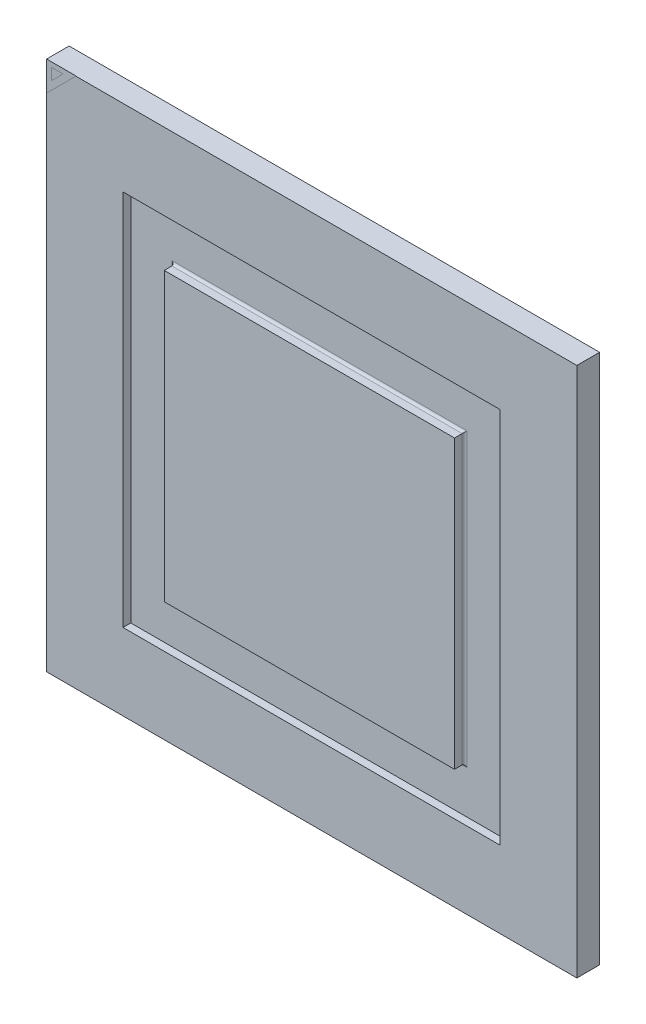
ISO-10303-21;
HEADER;
FILE_DESCRIPTION(('STEP AP214'),'2;1');
FILE_NAME('part.step','',(''),(''),'','','');
FILE_SCHEMA(('AUTOMOTIVE_DESIGN { 1 0 10303 214 1 1 1 1 }'));
ENDSEC;
DATA;
#1=APPLICATION_CONTEXT('core data for automotive mechanical design processes');
#2=APPLICATION_PROTOCOL_DEFINITION('international standard','automotive_design',2000,#1);
#3=PRODUCT_CONTEXT('',#1,'mechanical');
#4=PRODUCT('Part','Part','',(#3));
#5=PRODUCT_RELATED_PRODUCT_CATEGORY('part','',(#4));
#6=PRODUCT_DEFINITION_FORMATION('','',#4);
#7=PRODUCT_DEFINITION_CONTEXT('part definition',#1,'design');
#8=PRODUCT_DEFINITION('design','',#6,#7);
#9=PRODUCT_DEFINITION_SHAPE('','',#8);
#10=(LENGTH_UNIT() NAMED_UNIT(*) SI_UNIT(.MILLI.,.METRE.));
#11=(NAMED_UNIT(*) PLANE_ANGLE_UNIT() SI_UNIT($,.RADIAN.));
#12=(NAMED_UNIT(*) SI_UNIT($,.STERADIAN.) SOLID_ANGLE_UNIT());
#13=UNCERTAINTY_MEASURE_WITH_UNIT(LENGTH_MEASURE(1.E-05),#10,'distance_accuracy_value','');
#14=(GEOMETRIC_REPRESENTATION_CONTEXT(3) GLOBAL_UNCERTAINTY_ASSIGNED_CONTEXT((#13)) GLOBAL_UNIT_ASSIGNED_CONTEXT((#10,
#11,#12)) REPRESENTATION_CONTEXT('',''));
#15=CARTESIAN_POINT('',(0.,0.,0.));
#16=DIRECTION('',(0.,0.,1.));
#17=DIRECTION('',(1.,0.,0.));
#18=AXIS2_PLACEMENT_3D('',#15,#16,#17);
#19=CARTESIAN_POINT('',(-22.4999999999989,-22.4999999999989,2.41999999999997));
#20=DIRECTION('',(0.,0.,1.));
#21=DIRECTION('',(1.,0.,0.));
#22=AXIS2_PLACEMENT_3D('',#19,#20,#21);
#23=PLANE('',#22);
#24=DIRECTION('',(0.,1.,0.));
#25=VECTOR('',#24,1.);
#26=CARTESIAN_POINT('',(-12.309999999999,-12.1699999999996,2.41999999999997));
#27=LINE('',#26,#25);
#28=CARTESIAN_POINT('',(-12.309999999999,12.1699999999996,2.41999999999997));
#29=VERTEX_POINT('',#28);
#30=CARTESIAN_POINT('',(-12.309999999999,-12.1699999999996,2.41999999999997));
#31=VERTEX_POINT('',#30);
#32=EDGE_CURVE('E156',#29,#31,#27,.F.);
#33=ORIENTED_EDGE('',*,*,#32,.T.);
#34=DIRECTION('',(1.,0.,0.));
#35=VECTOR('',#34,1.);
#36=CARTESIAN_POINT('',(12.309999999999,-12.1699999999996,2.41999999999997));
#37=LINE('',#36,#35);
#38=CARTESIAN_POINT('',(12.309999999999,-12.1699999999996,2.41999999999997));
#39=VERTEX_POINT('',#38);
#40=EDGE_CURVE('E152',#31,#39,#37,.T.);
#41=ORIENTED_EDGE('',*,*,#40,.T.);
#42=DIRECTION('',(0.,1.,0.));
#43=VECTOR('',#42,1.);
#44=CARTESIAN_POINT('',(12.309999999999,12.1699999999996,2.41999999999997));
#45=LINE('',#44,#43);
#46=CARTESIAN_POINT('',(12.309999999999,12.1699999999996,2.41999999999997));
#47=VERTEX_POINT('',#46);
#48=EDGE_CURVE('E194',#39,#47,#45,.T.);
#49=ORIENTED_EDGE('',*,*,#48,.T.);
#50=DIRECTION('',(1.,0.,0.));
#51=VECTOR('',#50,1.);
#52=CARTESIAN_POINT('',(-12.309999999999,12.1699999999996,2.41999999999997));
#53=LINE('',#52,#51);
#54=EDGE_CURVE('E155',#47,#29,#53,.F.);
#55=ORIENTED_EDGE('',*,*,#54,.T.);
#56=EDGE_LOOP('',(#33,#41,#49,#55));
#57=FACE_BOUND('',#56,.T.);
#58=ADVANCED_FACE('F16',(#57),#23,.T.);
#59=CARTESIAN_POINT('',(12.309999999999,-12.1699999999996,2.41999999999997));
#60=DIRECTION('',(0.,1.,0.));
#61=DIRECTION('',(0.,0.,1.));
#62=AXIS2_PLACEMENT_3D('',#59,#60,#61);
#63=PLANE('',#62);
#64=ORIENTED_EDGE('',*,*,#40,.F.);
#65=DIRECTION('',(0.,0.,-1.));
#66=VECTOR('',#65,1.);
#67=CARTESIAN_POINT('',(-12.309999999999,-12.1699999999996,2.41999999999997));
#68=LINE('',#67,#66);
#69=CARTESIAN_POINT('',(-12.3099999999999,-12.169999999999,1.77000000000003));
#70=VERTEX_POINT('',#69);
#71=EDGE_CURVE('E145',#31,#70,#68,.T.);
#72=ORIENTED_EDGE('',*,*,#71,.T.);
#73=DIRECTION('',(1.,0.,0.));
#74=VECTOR('',#73,1.);
#75=CARTESIAN_POINT('',(-81.1620000000086,-12.1699999999988,1.77000000000003));
#76=LINE('',#75,#74);
#77=CARTESIAN_POINT('',(12.3099999999999,-12.169999999999,1.77000000000003));
#78=VERTEX_POINT('',#77);
#79=EDGE_CURVE('E150',#70,#78,#76,.T.);
#80=ORIENTED_EDGE('',*,*,#79,.T.);
#81=DIRECTION('',(0.,0.,1.));
#82=VECTOR('',#81,1.);
#83=CARTESIAN_POINT('',(12.309999999999,-12.1699999999996,2.41999999999997));
#84=LINE('',#83,#82);
#85=EDGE_CURVE('E192',#78,#39,#84,.T.);
#86=ORIENTED_EDGE('',*,*,#85,.T.);
#87=EDGE_LOOP('',(#64,#72,#80,#86));
#88=FACE_BOUND('',#87,.T.);
#89=ADVANCED_FACE('F147',(#88),#63,.F.);
#90=CARTESIAN_POINT('',(-12.309999999999,-12.1699999999996,2.41999999999997));
#91=DIRECTION('',(1.,0.,0.));
#92=DIRECTION('',(0.,0.,-1.));
#93=AXIS2_PLACEMENT_3D('',#90,#91,#92);
#94=PLANE('',#93);
#95=ORIENTED_EDGE('',*,*,#32,.F.);
#96=DIRECTION('',(0.,0.,-1.));
#97=VECTOR('',#96,1.);
#98=CARTESIAN_POINT('',(-12.309999999999,12.1699999999996,2.41999999999997));
#99=LINE('',#98,#97);
#100=CARTESIAN_POINT('',(-12.3099999999999,12.169999999999,1.77000000000003));
#101=VERTEX_POINT('',#100);
#102=EDGE_CURVE('E162',#29,#101,#99,.T.);
#103=ORIENTED_EDGE('',*,*,#102,.T.);
#104=DIRECTION('',(0.,-1.,0.));
#105=VECTOR('',#104,1.);
#106=CARTESIAN_POINT('',(-12.3100000000008,81.1620000000086,1.77000000000003));
#107=LINE('',#106,#105);
#108=EDGE_CURVE('E159',#101,#70,#107,.T.);
#109=ORIENTED_EDGE('',*,*,#108,.T.);
#110=ORIENTED_EDGE('',*,*,#71,.F.);
#111=EDGE_LOOP('',(#95,#103,#109,#110));
#112=FACE_BOUND('',#111,.T.);
#113=ADVANCED_FACE('F160',(#112),#94,.F.);
#114=CARTESIAN_POINT('',(-12.309999999999,12.1699999999996,2.41999999999997));
#115=DIRECTION('',(0.,-1.,0.));
#116=DIRECTION('',(0.,0.,-1.));
#117=AXIS2_PLACEMENT_3D('',#114,#115,#116);
#118=PLANE('',#117);
#119=ORIENTED_EDGE('',*,*,#54,.F.);
#120=DIRECTION('',(0.,0.,1.));
#121=VECTOR('',#120,1.);
#122=CARTESIAN_POINT('',(12.309999999999,12.1699999999996,2.41999999999997));
#123=LINE('',#122,#121);
#124=CARTESIAN_POINT('',(12.3099999999999,12.169999999999,1.77000000000003));
#125=VERTEX_POINT('',#124);
#126=EDGE_CURVE('E175',#47,#125,#123,.F.);
#127=ORIENTED_EDGE('',*,*,#126,.T.);
#128=DIRECTION('',(-1.,0.,0.));
#129=VECTOR('',#128,1.);
#130=CARTESIAN_POINT('',(81.1620000000086,12.1699999999988,1.77000000000003));
#131=LINE('',#130,#129);
#132=EDGE_CURVE('E181',#125,#101,#131,.T.);
#133=ORIENTED_EDGE('',*,*,#132,.T.);
#134=ORIENTED_EDGE('',*,*,#102,.F.);
#135=EDGE_LOOP('',(#119,#127,#133,#134));
#136=FACE_BOUND('',#135,.T.);
#137=ADVANCED_FACE('F422',(#136),#118,.F.);
#138=CARTESIAN_POINT('',(12.309999999999,12.1699999999996,2.41999999999997));
#139=DIRECTION('',(-1.,0.,0.));
#140=DIRECTION('',(0.,0.,1.));
#141=AXIS2_PLACEMENT_3D('',#138,#139,#140);
#142=PLANE('',#141);
#143=ORIENTED_EDGE('',*,*,#48,.F.);
#144=ORIENTED_EDGE('',*,*,#85,.F.);
#145=DIRECTION('',(0.,1.,0.));
#146=VECTOR('',#145,1.);
#147=CARTESIAN_POINT('',(12.3100000000008,-81.1620000000086,1.77000000000003));
#148=LINE('',#147,#146);
#149=EDGE_CURVE('E203',#78,#125,#148,.T.);
#150=ORIENTED_EDGE('',*,*,#149,.T.);
#151=ORIENTED_EDGE('',*,*,#126,.F.);
#152=EDGE_LOOP('',(#143,#144,#150,#151));
#153=FACE_BOUND('',#152,.T.);
#154=ADVANCED_FACE('F419',(#153),#142,.F.);
#155=CARTESIAN_POINT('',(-81.1620000000086,-12.3699999999988,1.77000000000003));
#156=DIRECTION('',(1.,0.,0.));
#157=DIRECTION('',(0.,0.,-1.));
#158=AXIS2_PLACEMENT_3D('',#155,#156,#157);
#159=CYLINDRICAL_SURFACE('',#158,0.199999999999987);
#160=ORIENTED_EDGE('',*,*,#79,.F.);
#161=CARTESIAN_POINT('',(-12.5100000000008,-12.3699999999988,1.77000000000003));
#162=DIRECTION('',(0.707106781186547,-0.707106781186547,0.));
#163=DIRECTION('',(0.707106781186547,0.707106781186547,0.));
#164=AXIS2_PLACEMENT_3D('',#161,#162,#163);
#165=ELLIPSE('',#164,0.282842712474601,0.199999999999987);
#166=CARTESIAN_POINT('',(-12.5100000000008,-12.3699999999988,1.57000000000007));
#167=VERTEX_POINT('',#166);
#168=EDGE_CURVE('E19',#70,#167,#165,.F.);
#169=ORIENTED_EDGE('',*,*,#168,.T.);
#170=DIRECTION('',(1.,0.,0.));
#171=VECTOR('',#170,1.);
#172=CARTESIAN_POINT('',(0.,-12.3699999999988,1.57000000000007));
#173=LINE('',#172,#171);
#174=CARTESIAN_POINT('',(12.5100000000008,-12.3699999999988,1.57000000000007));
#175=VERTEX_POINT('',#174);
#176=EDGE_CURVE('E188',#175,#167,#173,.F.);
#177=ORIENTED_EDGE('',*,*,#176,.F.);
#178=CARTESIAN_POINT('',(12.5100000000008,-12.3699999999988,1.77000000000003));
#179=DIRECTION('',(0.707106781186547,0.707106781186547,0.));
#180=DIRECTION('',(0.707106781186547,-0.707106781186547,0.));
#181=AXIS2_PLACEMENT_3D('',#178,#179,#180);
#182=ELLIPSE('',#181,0.282842712474601,0.199999999999987);
#183=EDGE_CURVE('E173',#175,#78,#182,.T.);
#184=ORIENTED_EDGE('',*,*,#183,.T.);
#185=EDGE_LOOP('',(#160,#169,#177,#184));
#186=FACE_BOUND('',#185,.T.);
#187=ADVANCED_FACE('F170',(#186),#159,.F.);
#188=CARTESIAN_POINT('',(-12.5100000000008,81.1620000000086,1.77000000000003));
#189=DIRECTION('',(0.,-1.,0.));
#190=DIRECTION('',(0.,0.,-1.));
#191=AXIS2_PLACEMENT_3D('',#188,#189,#190);
#192=CYLINDRICAL_SURFACE('',#191,0.199999999999987);
#193=DIRECTION('',(0.,1.,0.));
#194=VECTOR('',#193,1.);
#195=CARTESIAN_POINT('',(-12.5100000000008,-22.4999999999989,1.57000000000007));
#196=LINE('',#195,#194);
#197=CARTESIAN_POINT('',(-12.5100000000008,12.3699999999988,1.57000000000007));
#198=VERTEX_POINT('',#197);
#199=EDGE_CURVE('E179',#167,#198,#196,.T.);
#200=ORIENTED_EDGE('',*,*,#199,.F.);
#201=ORIENTED_EDGE('',*,*,#168,.F.);
#202=ORIENTED_EDGE('',*,*,#108,.F.);
#203=CARTESIAN_POINT('',(-12.5100000000008,12.3699999999988,1.77000000000003));
#204=DIRECTION('',(-0.707106781186547,-0.707106781186547,0.));
#205=DIRECTION('',(0.707106781186547,-0.707106781186547,0.));
#206=AXIS2_PLACEMENT_3D('',#203,#204,#205);
#207=ELLIPSE('',#206,0.282842712474601,0.199999999999987);
#208=EDGE_CURVE('E182',#101,#198,#207,.F.);
#209=ORIENTED_EDGE('',*,*,#208,.T.);
#210=EDGE_LOOP('',(#200,#201,#202,#209));
#211=FACE_BOUND('',#210,.T.);
#212=ADVANCED_FACE('F177',(#211),#192,.F.);
#213=CARTESIAN_POINT('',(81.1620000000086,12.3699999999988,1.77000000000003));
#214=DIRECTION('',(-1.,0.,0.));
#215=DIRECTION('',(0.,0.,1.));
#216=AXIS2_PLACEMENT_3D('',#213,#214,#215);
#217=CYLINDRICAL_SURFACE('',#216,0.199999999999987);
#218=DIRECTION('',(1.,0.,0.));
#219=VECTOR('',#218,1.);
#220=CARTESIAN_POINT('',(0.,12.3699999999988,1.57000000000007));
#221=LINE('',#220,#219);
#222=CARTESIAN_POINT('',(12.5100000000008,12.3699999999988,1.57000000000007));
#223=VERTEX_POINT('',#222);
#224=EDGE_CURVE('E190',#198,#223,#221,.T.);
#225=ORIENTED_EDGE('',*,*,#224,.F.);
#226=ORIENTED_EDGE('',*,*,#208,.F.);
#227=ORIENTED_EDGE('',*,*,#132,.F.);
#228=CARTESIAN_POINT('',(12.5100000000008,12.3699999999988,1.77000000000003));
#229=DIRECTION('',(-0.707106781186547,0.707106781186547,0.));
#230=DIRECTION('',(-0.707106781186547,-0.707106781186547,0.));
#231=AXIS2_PLACEMENT_3D('',#228,#229,#230);
#232=ELLIPSE('',#231,0.282842712474601,0.199999999999987);
#233=EDGE_CURVE('E201',#125,#223,#232,.F.);
#234=ORIENTED_EDGE('',*,*,#233,.T.);
#235=EDGE_LOOP('',(#225,#226,#227,#234));
#236=FACE_BOUND('',#235,.T.);
#237=ADVANCED_FACE('F410',(#236),#217,.F.);
#238=CARTESIAN_POINT('',(12.5100000000008,-81.1620000000086,1.77000000000003));
#239=DIRECTION('',(0.,1.,0.));
#240=DIRECTION('',(0.,0.,1.));
#241=AXIS2_PLACEMENT_3D('',#238,#239,#240);
#242=CYLINDRICAL_SURFACE('',#241,0.199999999999987);
#243=ORIENTED_EDGE('',*,*,#149,.F.);
#244=ORIENTED_EDGE('',*,*,#183,.F.);
#245=DIRECTION('',(0.,1.,0.));
#246=VECTOR('',#245,1.);
#247=CARTESIAN_POINT('',(12.5100000000008,-22.4999999999989,1.57000000000007));
#248=LINE('',#247,#246);
#249=EDGE_CURVE('E214',#223,#175,#248,.F.);
#250=ORIENTED_EDGE('',*,*,#249,.F.);
#251=ORIENTED_EDGE('',*,*,#233,.F.);
#252=EDGE_LOOP('',(#243,#244,#250,#251));
#253=FACE_BOUND('',#252,.T.);
#254=ADVANCED_FACE('F404',(#253),#242,.F.);
#255=CARTESIAN_POINT('',(0.,-22.4999999999989,2.18999999999988));
#256=DIRECTION('',(0.,0.,1.));
#257=DIRECTION('',(1.,0.,0.));
#258=AXIS2_PLACEMENT_3D('',#255,#256,#257);
#259=PLANE('',#258);
#260=DIRECTION('',(1.,0.,0.));
#261=VECTOR('',#260,1.);
#262=CARTESIAN_POINT('',(-21.0999999999994,22.1000000000005,2.18999999999988));
#263=LINE('',#262,#261);
#264=CARTESIAN_POINT('',(-21.0999999999994,22.1000000000005,2.18999999999988));
#265=VERTEX_POINT('',#264);
#266=CARTESIAN_POINT('',(-22.1000000000005,22.1000000000005,2.18999999999988));
#267=VERTEX_POINT('',#266);
#268=EDGE_CURVE('E211',#265,#267,#263,.F.);
#269=ORIENTED_EDGE('',*,*,#268,.T.);
#270=DIRECTION('',(0.,1.,0.));
#271=VECTOR('',#270,1.);
#272=CARTESIAN_POINT('',(-22.1000000000005,22.1000000000005,2.18999999999988));
#273=LINE('',#272,#271);
#274=CARTESIAN_POINT('',(-22.1000000000005,21.0999999999994,2.18999999999988));
#275=VERTEX_POINT('',#274);
#276=EDGE_CURVE('E228',#267,#275,#273,.F.);
#277=ORIENTED_EDGE('',*,*,#276,.T.);
#278=DIRECTION('',(0.707106781186548,0.707106781186548,0.));
#279=VECTOR('',#278,1.);
#280=CARTESIAN_POINT('',(-22.1000000000005,21.0999999999994,2.18999999999988));
#281=LINE('',#280,#279);
#282=EDGE_CURVE('E218',#275,#265,#281,.T.);
#283=ORIENTED_EDGE('',*,*,#282,.T.);
#284=EDGE_LOOP('',(#269,#277,#283));
#285=FACE_BOUND('',#284,.T.);
#286=ADVANCED_FACE('F396',(#285),#259,.T.);
#287=CARTESIAN_POINT('',(0.,-22.4999999999989,1.57000000000007));
#288=DIRECTION('',(0.,0.,1.));
#289=DIRECTION('',(1.,0.,0.));
#290=AXIS2_PLACEMENT_3D('',#287,#288,#289);
#291=PLANE('',#290);
#292=ORIENTED_EDGE('',*,*,#224,.T.);
#293=ORIENTED_EDGE('',*,*,#249,.T.);
#294=ORIENTED_EDGE('',*,*,#176,.T.);
#295=ORIENTED_EDGE('',*,*,#199,.T.);
#296=EDGE_LOOP('',(#292,#293,#294,#295));
#297=FACE_BOUND('',#296,.T.);
#298=DIRECTION('',(0.,1.,0.));
#299=VECTOR('',#298,1.);
#300=CARTESIAN_POINT('',(-15.9999999999995,-15.9999999999995,1.57000000000007));
#301=LINE('',#300,#299);
#302=CARTESIAN_POINT('',(-15.9999999999995,-15.9999999999995,1.57000000000007));
#303=VERTEX_POINT('',#302);
#304=CARTESIAN_POINT('',(-15.9999999999995,15.9999999999995,1.57000000000007));
#305=VERTEX_POINT('',#304);
#306=EDGE_CURVE('E236',#303,#305,#301,.T.);
#307=ORIENTED_EDGE('',*,*,#306,.F.);
#308=DIRECTION('',(1.,0.,0.));
#309=VECTOR('',#308,1.);
#310=CARTESIAN_POINT('',(15.9999999999995,-15.9999999999995,1.57000000000007));
#311=LINE('',#310,#309);
#312=CARTESIAN_POINT('',(15.9999999999995,-15.9999999999995,1.57000000000007));
#313=VERTEX_POINT('',#312);
#314=EDGE_CURVE('E254',#313,#303,#311,.F.);
#315=ORIENTED_EDGE('',*,*,#314,.F.);
#316=DIRECTION('',(0.,1.,0.));
#317=VECTOR('',#316,1.);
#318=CARTESIAN_POINT('',(15.9999999999995,15.9999999999995,1.57000000000007));
#319=LINE('',#318,#317);
#320=CARTESIAN_POINT('',(15.9999999999995,15.9999999999995,1.57000000000007));
#321=VERTEX_POINT('',#320);
#322=EDGE_CURVE('E246',#321,#313,#319,.F.);
#323=ORIENTED_EDGE('',*,*,#322,.F.);
#324=DIRECTION('',(1.,0.,0.));
#325=VECTOR('',#324,1.);
#326=CARTESIAN_POINT('',(-15.9999999999995,15.9999999999995,1.57000000000007));
#327=LINE('',#326,#325);
#328=EDGE_CURVE('E241',#305,#321,#327,.T.);
#329=ORIENTED_EDGE('',*,*,#328,.F.);
#330=EDGE_LOOP('',(#307,#315,#323,#329));
#331=FACE_BOUND('',#330,.T.);
#332=ADVANCED_FACE('F391',(#297,#331),#291,.T.);
#333=CARTESIAN_POINT('',(-21.0999999999994,22.1000000000005,2.21000000000005));
#334=DIRECTION('',(0.,1.,0.));
#335=DIRECTION('',(0.,0.,1.));
#336=AXIS2_PLACEMENT_3D('',#333,#334,#335);
#337=PLANE('',#336);
#338=ORIENTED_EDGE('',*,*,#268,.F.);
#339=DIRECTION('',(0.,0.,1.));
#340=VECTOR('',#339,1.);
#341=CARTESIAN_POINT('',(-21.0999999999994,22.1000000000005,2.21000000000005));
#342=LINE('',#341,#340);
#343=CARTESIAN_POINT('',(-21.0999999999994,22.1000000000005,2.21000000000005));
#344=VERTEX_POINT('',#343);
#345=EDGE_CURVE('E222',#265,#344,#342,.T.);
#346=ORIENTED_EDGE('',*,*,#345,.T.);
#347=DIRECTION('',(1.,0.,0.));
#348=VECTOR('',#347,1.);
#349=CARTESIAN_POINT('',(0.,22.1000000000005,2.21000000000005));
#350=LINE('',#349,#348);
#351=CARTESIAN_POINT('',(-22.1000000000005,22.1000000000005,2.21000000000005));
#352=VERTEX_POINT('',#351);
#353=EDGE_CURVE('E260',#352,#344,#350,.T.);
#354=ORIENTED_EDGE('',*,*,#353,.F.);
#355=DIRECTION('',(0.,0.,1.));
#356=VECTOR('',#355,1.);
#357=CARTESIAN_POINT('',(-22.1000000000005,22.1000000000005,2.21000000000005));
#358=LINE('',#357,#356);
#359=EDGE_CURVE('E224',#352,#267,#358,.F.);
#360=ORIENTED_EDGE('',*,*,#359,.T.);
#361=EDGE_LOOP('',(#338,#346,#354,#360));
#362=FACE_BOUND('',#361,.T.);
#363=ADVANCED_FACE('F395',(#362),#337,.F.);
#364=CARTESIAN_POINT('',(-22.1000000000005,21.0999999999994,2.21000000000005));
#365=DIRECTION('',(0.707106781186548,-0.707106781186548,0.));
#366=DIRECTION('',(0.707106781186548,0.707106781186548,0.));
#367=AXIS2_PLACEMENT_3D('',#364,#365,#366);
#368=PLANE('',#367);
#369=ORIENTED_EDGE('',*,*,#282,.F.);
#370=DIRECTION('',(0.,0.,1.));
#371=VECTOR('',#370,1.);
#372=CARTESIAN_POINT('',(-22.1000000000005,21.0999999999994,2.21000000000005));
#373=LINE('',#372,#371);
#374=CARTESIAN_POINT('',(-22.1000000000005,21.0999999999994,2.21000000000005));
#375=VERTEX_POINT('',#374);
#376=EDGE_CURVE('E230',#275,#375,#373,.T.);
#377=ORIENTED_EDGE('',*,*,#376,.T.);
#378=DIRECTION('',(-0.707106781186547,-0.707106781186547,0.));
#379=VECTOR('',#378,1.);
#380=CARTESIAN_POINT('',(-21.0999999999994,22.1000000000005,2.21000000000005));
#381=LINE('',#380,#379);
#382=EDGE_CURVE('E263',#344,#375,#381,.T.);
#383=ORIENTED_EDGE('',*,*,#382,.F.);
#384=ORIENTED_EDGE('',*,*,#345,.F.);
#385=EDGE_LOOP('',(#369,#377,#383,#384));
#386=FACE_BOUND('',#385,.T.);
#387=ADVANCED_FACE('F351',(#386),#368,.F.);
#388=CARTESIAN_POINT('',(-22.1000000000005,22.1000000000005,2.21000000000005));
#389=DIRECTION('',(-1.,0.,0.));
#390=DIRECTION('',(0.,0.,1.));
#391=AXIS2_PLACEMENT_3D('',#388,#389,#390);
#392=PLANE('',#391);
#393=ORIENTED_EDGE('',*,*,#276,.F.);
#394=ORIENTED_EDGE('',*,*,#359,.F.);
#395=DIRECTION('',(0.,1.,0.));
#396=VECTOR('',#395,1.);
#397=CARTESIAN_POINT('',(-22.1000000000005,-22.4999999999989,2.21000000000005));
#398=LINE('',#397,#396);
#399=EDGE_CURVE('E266',#375,#352,#398,.T.);
#400=ORIENTED_EDGE('',*,*,#399,.F.);
#401=ORIENTED_EDGE('',*,*,#376,.F.);
#402=EDGE_LOOP('',(#393,#394,#400,#401));
#403=FACE_BOUND('',#402,.T.);
#404=ADVANCED_FACE('F341',(#403),#392,.F.);
#405=CARTESIAN_POINT('',(-22.4999999999989,19.9999999999987,2.22999999999997));
#406=DIRECTION('',(0.707106781186548,-0.707106781186548,0.));
#407=DIRECTION('',(0.707106781186548,0.707106781186548,0.));
#408=AXIS2_PLACEMENT_3D('',#405,#406,#407);
#409=PLANE('',#408);
#410=DIRECTION('',(0.707106781186547,0.707106781186548,0.));
#411=VECTOR('',#410,1.);
#412=CARTESIAN_POINT('',(-22.4999999999989,19.9999999999987,2.21000000000005));
#413=LINE('',#412,#411);
#414=CARTESIAN_POINT('',(-22.4999999999989,19.9999999999987,2.21000000000005));
#415=VERTEX_POINT('',#414);
#416=CARTESIAN_POINT('',(-19.9999999999987,22.4999999999989,2.21000000000005));
#417=VERTEX_POINT('',#416);
#418=EDGE_CURVE('E257',#415,#417,#413,.T.);
#419=ORIENTED_EDGE('',*,*,#418,.F.);
#420=DIRECTION('',(0.,0.,1.));
#421=VECTOR('',#420,1.);
#422=CARTESIAN_POINT('',(-22.4999999999989,19.9999999999987,2.22999999999997));
#423=LINE('',#422,#421);
#424=CARTESIAN_POINT('',(-22.4999999999989,19.9999999999987,2.22999999999997));
#425=VERTEX_POINT('',#424);
#426=EDGE_CURVE('E232',#425,#415,#423,.F.);
#427=ORIENTED_EDGE('',*,*,#426,.F.);
#428=DIRECTION('',(-0.707106781186547,-0.707106781186548,0.));
#429=VECTOR('',#428,1.);
#430=CARTESIAN_POINT('',(-19.9999999999987,22.4999999999989,2.22999999999997));
#431=LINE('',#430,#429);
#432=CARTESIAN_POINT('',(-19.9999999999987,22.4999999999989,2.22999999999997));
#433=VERTEX_POINT('',#432);
#434=EDGE_CURVE('E269',#433,#425,#431,.T.);
#435=ORIENTED_EDGE('',*,*,#434,.F.);
#436=DIRECTION('',(0.,0.,1.));
#437=VECTOR('',#436,1.);
#438=CARTESIAN_POINT('',(-19.9999999999987,22.4999999999989,2.22999999999997));
#439=LINE('',#438,#437);
#440=EDGE_CURVE('E234',#417,#433,#439,.T.);
#441=ORIENTED_EDGE('',*,*,#440,.F.);
#442=EDGE_LOOP('',(#419,#427,#435,#441));
#443=FACE_BOUND('',#442,.T.);
#444=ADVANCED_FACE('F338',(#443),#409,.F.);
#445=CARTESIAN_POINT('',(-15.9999999999995,-15.9999999999995,1.57000000000007));
#446=DIRECTION('',(1.,0.,0.));
#447=DIRECTION('',(0.,0.,-1.));
#448=AXIS2_PLACEMENT_3D('',#445,#446,#447);
#449=PLANE('',#448);
#450=DIRECTION('',(0.,0.,1.));
#451=VECTOR('',#450,1.);
#452=CARTESIAN_POINT('',(-15.9999999999995,-15.9999999999995,1.57000000000007));
#453=LINE('',#452,#451);
#454=CARTESIAN_POINT('',(-15.9999999999995,-15.9999999999995,2.22999999999997));
#455=VERTEX_POINT('',#454);
#456=EDGE_CURVE('E248',#303,#455,#453,.T.);
#457=ORIENTED_EDGE('',*,*,#456,.F.);
#458=ORIENTED_EDGE('',*,*,#306,.T.);
#459=DIRECTION('',(0.,0.,-1.));
#460=VECTOR('',#459,1.);
#461=CARTESIAN_POINT('',(-15.9999999999995,15.9999999999995,1.57000000000007));
#462=LINE('',#461,#460);
#463=CARTESIAN_POINT('',(-15.9999999999995,15.9999999999995,2.22999999999997));
#464=VERTEX_POINT('',#463);
#465=EDGE_CURVE('E238',#464,#305,#462,.T.);
#466=ORIENTED_EDGE('',*,*,#465,.F.);
#467=DIRECTION('',(0.,1.,0.));
#468=VECTOR('',#467,1.);
#469=CARTESIAN_POINT('',(-15.9999999999995,-22.4999999999989,2.22999999999997));
#470=LINE('',#469,#468);
#471=EDGE_CURVE('E272',#455,#464,#470,.T.);
#472=ORIENTED_EDGE('',*,*,#471,.F.);
#473=EDGE_LOOP('',(#457,#458,#466,#472));
#474=FACE_BOUND('',#473,.T.);
#475=ADVANCED_FACE('F340',(#474),#449,.T.);
#476=CARTESIAN_POINT('',(-15.9999999999995,15.9999999999995,1.57000000000007));
#477=DIRECTION('',(0.,-1.,0.));
#478=DIRECTION('',(0.,0.,-1.));
#479=AXIS2_PLACEMENT_3D('',#476,#477,#478);
#480=PLANE('',#479);
#481=ORIENTED_EDGE('',*,*,#465,.T.);
#482=ORIENTED_EDGE('',*,*,#328,.T.);
#483=DIRECTION('',(0.,0.,1.));
#484=VECTOR('',#483,1.);
#485=CARTESIAN_POINT('',(15.9999999999995,15.9999999999995,1.57000000000007));
#486=LINE('',#485,#484);
#487=CARTESIAN_POINT('',(15.9999999999995,15.9999999999995,2.22999999999997));
#488=VERTEX_POINT('',#487);
#489=EDGE_CURVE('E243',#488,#321,#486,.F.);
#490=ORIENTED_EDGE('',*,*,#489,.F.);
#491=DIRECTION('',(1.,0.,0.));
#492=VECTOR('',#491,1.);
#493=CARTESIAN_POINT('',(0.,15.9999999999995,2.22999999999997));
#494=LINE('',#493,#492);
#495=EDGE_CURVE('E275',#464,#488,#494,.T.);
#496=ORIENTED_EDGE('',*,*,#495,.F.);
#497=EDGE_LOOP('',(#481,#482,#490,#496));
#498=FACE_BOUND('',#497,.T.);
#499=ADVANCED_FACE('F348',(#498),#480,.T.);
#500=CARTESIAN_POINT('',(15.9999999999995,15.9999999999995,1.57000000000007));
#501=DIRECTION('',(-1.,0.,0.));
#502=DIRECTION('',(0.,0.,1.));
#503=AXIS2_PLACEMENT_3D('',#500,#501,#502);
#504=PLANE('',#503);
#505=ORIENTED_EDGE('',*,*,#489,.T.);
#506=ORIENTED_EDGE('',*,*,#322,.T.);
#507=DIRECTION('',(0.,0.,1.));
#508=VECTOR('',#507,1.);
#509=CARTESIAN_POINT('',(15.9999999999995,-15.9999999999995,1.57000000000007));
#510=LINE('',#509,#508);
#511=CARTESIAN_POINT('',(15.9999999999995,-15.9999999999995,2.22999999999997));
#512=VERTEX_POINT('',#511);
#513=EDGE_CURVE('E251',#512,#313,#510,.F.);
#514=ORIENTED_EDGE('',*,*,#513,.F.);
#515=DIRECTION('',(0.,1.,0.));
#516=VECTOR('',#515,1.);
#517=CARTESIAN_POINT('',(15.9999999999995,-22.4999999999989,2.22999999999997));
#518=LINE('',#517,#516);
#519=EDGE_CURVE('E278',#488,#512,#518,.F.);
#520=ORIENTED_EDGE('',*,*,#519,.F.);
#521=EDGE_LOOP('',(#505,#506,#514,#520));
#522=FACE_BOUND('',#521,.T.);
#523=ADVANCED_FACE('F376',(#522),#504,.T.);
#524=CARTESIAN_POINT('',(15.9999999999995,-15.9999999999995,1.57000000000007));
#525=DIRECTION('',(0.,1.,0.));
#526=DIRECTION('',(0.,0.,1.));
#527=AXIS2_PLACEMENT_3D('',#524,#525,#526);
#528=PLANE('',#527);
#529=ORIENTED_EDGE('',*,*,#513,.T.);
#530=ORIENTED_EDGE('',*,*,#314,.T.);
#531=ORIENTED_EDGE('',*,*,#456,.T.);
#532=DIRECTION('',(1.,0.,0.));
#533=VECTOR('',#532,1.);
#534=CARTESIAN_POINT('',(0.,-15.9999999999995,2.22999999999997));
#535=LINE('',#534,#533);
#536=EDGE_CURVE('E281',#512,#455,#535,.F.);
#537=ORIENTED_EDGE('',*,*,#536,.F.);
#538=EDGE_LOOP('',(#529,#530,#531,#537));
#539=FACE_BOUND('',#538,.T.);
#540=ADVANCED_FACE('F372',(#539),#528,.T.);
#541=CARTESIAN_POINT('',(0.,-22.4999999999989,2.21000000000005));
#542=DIRECTION('',(0.,0.,1.));
#543=DIRECTION('',(1.,0.,0.));
#544=AXIS2_PLACEMENT_3D('',#541,#542,#543);
#545=PLANE('',#544);
#546=ORIENTED_EDGE('',*,*,#382,.T.);
#547=ORIENTED_EDGE('',*,*,#399,.T.);
#548=ORIENTED_EDGE('',*,*,#353,.T.);
#549=EDGE_LOOP('',(#546,#547,#548));
#550=FACE_BOUND('',#549,.T.);
#551=DIRECTION('',(0.,1.,0.));
#552=VECTOR('',#551,1.);
#553=CARTESIAN_POINT('',(-22.4999999999989,-22.4999999999989,2.21000000000005));
#554=LINE('',#553,#552);
#555=CARTESIAN_POINT('',(-22.4999999999989,22.4999999999989,2.21000000000005));
#556=VERTEX_POINT('',#555);
#557=EDGE_CURVE('E284',#415,#556,#554,.T.);
#558=ORIENTED_EDGE('',*,*,#557,.F.);
#559=ORIENTED_EDGE('',*,*,#418,.T.);
#560=DIRECTION('',(1.,0.,0.));
#561=VECTOR('',#560,1.);
#562=CARTESIAN_POINT('',(0.,22.4999999999989,2.21000000000005));
#563=LINE('',#562,#561);
#564=EDGE_CURVE('E292',#556,#417,#563,.T.);
#565=ORIENTED_EDGE('',*,*,#564,.F.);
#566=EDGE_LOOP('',(#558,#559,#565));
#567=FACE_BOUND('',#566,.T.);
#568=ADVANCED_FACE('F335',(#550,#567),#545,.T.);
#569=CARTESIAN_POINT('',(0.,-22.4999999999989,2.22999999999997));
#570=DIRECTION('',(0.,0.,1.));
#571=DIRECTION('',(1.,0.,0.));
#572=AXIS2_PLACEMENT_3D('',#569,#570,#571);
#573=PLANE('',#572);
#574=ORIENTED_EDGE('',*,*,#519,.T.);
#575=ORIENTED_EDGE('',*,*,#536,.T.);
#576=ORIENTED_EDGE('',*,*,#471,.T.);
#577=ORIENTED_EDGE('',*,*,#495,.T.);
#578=EDGE_LOOP('',(#574,#575,#576,#577));
#579=FACE_BOUND('',#578,.T.);
#580=DIRECTION('',(1.,0.,0.));
#581=VECTOR('',#580,1.);
#582=CARTESIAN_POINT('',(0.,22.4999999999989,2.22999999999997));
#583=LINE('',#582,#581);
#584=CARTESIAN_POINT('',(22.4999999999989,22.4999999999989,2.22999999999997));
#585=VERTEX_POINT('',#584);
#586=EDGE_CURVE('E295',#433,#585,#583,.T.);
#587=ORIENTED_EDGE('',*,*,#586,.F.);
#588=ORIENTED_EDGE('',*,*,#434,.T.);
#589=DIRECTION('',(0.,1.,0.));
#590=VECTOR('',#589,1.);
#591=CARTESIAN_POINT('',(-22.4999999999989,-22.4999999999989,2.22999999999997));
#592=LINE('',#591,#590);
#593=CARTESIAN_POINT('',(-22.4999999999989,-22.4999999999989,2.22999999999997));
#594=VERTEX_POINT('',#593);
#595=EDGE_CURVE('E286',#594,#425,#592,.T.);
#596=ORIENTED_EDGE('',*,*,#595,.F.);
#597=DIRECTION('',(1.,0.,0.));
#598=VECTOR('',#597,1.);
#599=CARTESIAN_POINT('',(0.,-22.4999999999989,2.22999999999997));
#600=LINE('',#599,#598);
#601=CARTESIAN_POINT('',(22.4999999999989,-22.4999999999989,2.22999999999997));
#602=VERTEX_POINT('',#601);
#603=EDGE_CURVE('E305',#594,#602,#600,.T.);
#604=ORIENTED_EDGE('',*,*,#603,.T.);
#605=DIRECTION('',(0.,1.,0.));
#606=VECTOR('',#605,1.);
#607=CARTESIAN_POINT('',(22.4999999999989,-22.4999999999989,2.22999999999997));
#608=LINE('',#607,#606);
#609=EDGE_CURVE('E300',#585,#602,#608,.F.);
#610=ORIENTED_EDGE('',*,*,#609,.F.);
#611=EDGE_LOOP('',(#587,#588,#596,#604,#610));
#612=FACE_BOUND('',#611,.T.);
#613=ADVANCED_FACE('F325',(#579,#612),#573,.T.);
#614=CARTESIAN_POINT('',(-22.4999999999989,-22.4999999999989,0.30000000000007));
#615=DIRECTION('',(-1.,0.,0.));
#616=DIRECTION('',(0.,0.,1.));
#617=AXIS2_PLACEMENT_3D('',#614,#615,#616);
#618=PLANE('',#617);
#619=DIRECTION('',(0.,0.,1.));
#620=VECTOR('',#619,1.);
#621=CARTESIAN_POINT('',(-22.4999999999989,-22.4999999999989,0.));
#622=LINE('',#621,#620);
#623=CARTESIAN_POINT('',(-22.4999999999989,-22.4999999999989,0.30000000000007));
#624=VERTEX_POINT('',#623);
#625=EDGE_CURVE('E302',#624,#594,#622,.T.);
#626=ORIENTED_EDGE('',*,*,#625,.T.);
#627=ORIENTED_EDGE('',*,*,#595,.T.);
#628=ORIENTED_EDGE('',*,*,#426,.T.);
#629=ORIENTED_EDGE('',*,*,#557,.T.);
#630=DIRECTION('',(0.,0.,1.));
#631=VECTOR('',#630,1.);
#632=CARTESIAN_POINT('',(-22.4999999999989,22.4999999999989,0.));
#633=LINE('',#632,#631);
#634=CARTESIAN_POINT('',(-22.4999999999989,22.4999999999989,0.30000000000007));
#635=VERTEX_POINT('',#634);
#636=EDGE_CURVE('E289',#635,#556,#633,.T.);
#637=ORIENTED_EDGE('',*,*,#636,.F.);
#638=DIRECTION('',(0.,1.,0.));
#639=VECTOR('',#638,1.);
#640=CARTESIAN_POINT('',(-22.4999999999989,-22.4999999999989,0.30000000000007));
#641=LINE('',#640,#639);
#642=EDGE_CURVE('E308',#624,#635,#641,.T.);
#643=ORIENTED_EDGE('',*,*,#642,.F.);
#644=EDGE_LOOP('',(#626,#627,#628,#629,#637,#643));
#645=FACE_BOUND('',#644,.T.);
#646=ADVANCED_FACE('F331',(#645),#618,.T.);
#647=CARTESIAN_POINT('',(0.,22.4999999999989,0.));
#648=DIRECTION('',(0.,1.,0.));
#649=DIRECTION('',(0.,0.,1.));
#650=AXIS2_PLACEMENT_3D('',#647,#648,#649);
#651=PLANE('',#650);
#652=ORIENTED_EDGE('',*,*,#440,.T.);
#653=ORIENTED_EDGE('',*,*,#586,.T.);
#654=DIRECTION('',(0.,0.,-1.));
#655=VECTOR('',#654,1.);
#656=CARTESIAN_POINT('',(22.4999999999989,22.4999999999989,2.41999999999997));
#657=LINE('',#656,#655);
#658=CARTESIAN_POINT('',(22.4999999999989,22.4999999999989,0.30000000000007));
#659=VERTEX_POINT('',#658);
#660=EDGE_CURVE('E297',#659,#585,#657,.F.);
#661=ORIENTED_EDGE('',*,*,#660,.F.);
#662=DIRECTION('',(-1.,0.,0.));
#663=VECTOR('',#662,1.);
#664=CARTESIAN_POINT('',(22.4999999999989,22.4999999999989,0.30000000000007));
#665=LINE('',#664,#663);
#666=EDGE_CURVE('E311',#635,#659,#665,.F.);
#667=ORIENTED_EDGE('',*,*,#666,.F.);
#668=ORIENTED_EDGE('',*,*,#636,.T.);
#669=ORIENTED_EDGE('',*,*,#564,.T.);
#670=EDGE_LOOP('',(#652,#653,#661,#667,#668,#669));
#671=FACE_BOUND('',#670,.T.);
#672=ADVANCED_FACE('F321',(#671),#651,.T.);
#673=CARTESIAN_POINT('',(22.4999999999989,-22.4999999999989,2.41999999999997));
#674=DIRECTION('',(1.,0.,0.));
#675=DIRECTION('',(0.,0.,-1.));
#676=AXIS2_PLACEMENT_3D('',#673,#674,#675);
#677=PLANE('',#676);
#678=ORIENTED_EDGE('',*,*,#609,.T.);
#679=DIRECTION('',(0.,0.,1.));
#680=VECTOR('',#679,1.);
#681=CARTESIAN_POINT('',(22.4999999999989,-22.4999999999989,0.));
#682=LINE('',#681,#680);
#683=CARTESIAN_POINT('',(22.4999999999989,-22.4999999999989,0.30000000000007));
#684=VERTEX_POINT('',#683);
#685=EDGE_CURVE('E34',#602,#684,#682,.F.);
#686=ORIENTED_EDGE('',*,*,#685,.T.);
#687=DIRECTION('',(0.,1.,0.));
#688=VECTOR('',#687,1.);
#689=CARTESIAN_POINT('',(22.4999999999989,-22.4999999999989,0.30000000000007));
#690=LINE('',#689,#688);
#691=EDGE_CURVE('E25',#659,#684,#690,.F.);
#692=ORIENTED_EDGE('',*,*,#691,.F.);
#693=ORIENTED_EDGE('',*,*,#660,.T.);
#694=EDGE_LOOP('',(#678,#686,#692,#693));
#695=FACE_BOUND('',#694,.T.);
#696=ADVANCED_FACE('F318',(#695),#677,.T.);
#697=CARTESIAN_POINT('',(0.,-22.4999999999989,0.));
#698=DIRECTION('',(0.,1.,0.));
#699=DIRECTION('',(0.,0.,1.));
#700=AXIS2_PLACEMENT_3D('',#697,#698,#699);
#701=PLANE('',#700);
#702=ORIENTED_EDGE('',*,*,#685,.F.);
#703=ORIENTED_EDGE('',*,*,#603,.F.);
#704=ORIENTED_EDGE('',*,*,#625,.F.);
#705=DIRECTION('',(-1.,0.,0.));
#706=VECTOR('',#705,1.);
#707=CARTESIAN_POINT('',(22.4999999999989,-22.4999999999989,0.30000000000007));
#708=LINE('',#707,#706);
#709=EDGE_CURVE('E10',#684,#624,#708,.T.);
#710=ORIENTED_EDGE('',*,*,#709,.F.);
#711=EDGE_LOOP('',(#702,#703,#704,#710));
#712=FACE_BOUND('',#711,.T.);
#713=ADVANCED_FACE('F329',(#712),#701,.F.);
#714=CARTESIAN_POINT('',(22.4999999999989,-22.4999999999989,0.30000000000007));
#715=DIRECTION('',(0.,0.,-1.));
#716=DIRECTION('',(-1.,0.,0.));
#717=AXIS2_PLACEMENT_3D('',#714,#715,#716);
#718=PLANE('',#717);
#719=ORIENTED_EDGE('',*,*,#691,.T.);
#720=ORIENTED_EDGE('',*,*,#709,.T.);
#721=ORIENTED_EDGE('',*,*,#642,.T.);
#722=ORIENTED_EDGE('',*,*,#666,.T.);
#723=EDGE_LOOP('',(#719,#720,#721,#722));
#724=FACE_BOUND('',#723,.T.);
#725=ADVANCED_FACE('F316',(#724),#718,.T.);
#726=CLOSED_SHELL('',(#58,#89,#113,#137,#154,#187,#212,#237,#254,#286,#332,#363,#387,#404,#444,
#475,#499,#523,#540,#568,#613,#646,#672,#696,#713,#725));
#727=MANIFOLD_SOLID_BREP('B1',#726);
#728=ADVANCED_BREP_SHAPE_REPRESENTATION('',(#18,#727),#14);
#729=SHAPE_DEFINITION_REPRESENTATION(#9,#728);
ENDSEC;
END-ISO-10303-21;
